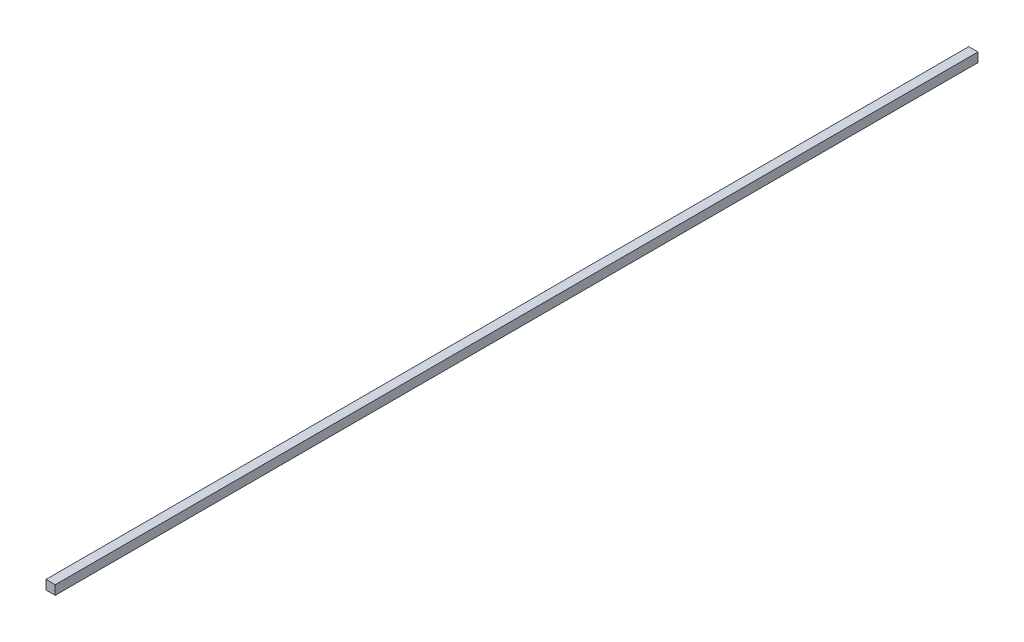
ISO-10303-21;
HEADER;
FILE_DESCRIPTION(('STEP AP214'),'2;1');
FILE_NAME('part.step','',(''),(''),'','','');
FILE_SCHEMA(('AUTOMOTIVE_DESIGN { 1 0 10303 214 1 1 1 1 }'));
ENDSEC;
DATA;
#1=APPLICATION_CONTEXT('core data for automotive mechanical design processes');
#2=APPLICATION_PROTOCOL_DEFINITION('international standard','automotive_design',2000,#1);
#3=PRODUCT_CONTEXT('',#1,'mechanical');
#4=PRODUCT('Part','Part','',(#3));
#5=PRODUCT_RELATED_PRODUCT_CATEGORY('part','',(#4));
#6=PRODUCT_DEFINITION_FORMATION('','',#4);
#7=PRODUCT_DEFINITION_CONTEXT('part definition',#1,'design');
#8=PRODUCT_DEFINITION('design','',#6,#7);
#9=PRODUCT_DEFINITION_SHAPE('','',#8);
#10=(LENGTH_UNIT() NAMED_UNIT(*) SI_UNIT(.MILLI.,.METRE.));
#11=(NAMED_UNIT(*) PLANE_ANGLE_UNIT() SI_UNIT($,.RADIAN.));
#12=(NAMED_UNIT(*) SI_UNIT($,.STERADIAN.) SOLID_ANGLE_UNIT());
#13=UNCERTAINTY_MEASURE_WITH_UNIT(LENGTH_MEASURE(1.E-05),#10,'distance_accuracy_value','');
#14=(GEOMETRIC_REPRESENTATION_CONTEXT(3) GLOBAL_UNCERTAINTY_ASSIGNED_CONTEXT((#13)) GLOBAL_UNIT_ASSIGNED_CONTEXT((#10,
#11,#12)) REPRESENTATION_CONTEXT('',''));
#15=CARTESIAN_POINT('',(0.,0.,0.));
#16=DIRECTION('',(0.,0.,1.));
#17=DIRECTION('',(1.,0.,0.));
#18=AXIS2_PLACEMENT_3D('',#15,#16,#17);
#19=CARTESIAN_POINT('',(0.,0.,1000.));
#20=DIRECTION('',(-1.,0.,0.));
#21=DIRECTION('',(0.,0.,1.));
#22=AXIS2_PLACEMENT_3D('',#19,#20,#21);
#23=PLANE('',#22);
#24=DIRECTION('',(0.,1.,0.));
#25=VECTOR('',#24,1.);
#26=CARTESIAN_POINT('',(0.,0.,0.));
#27=LINE('',#26,#25);
#28=CARTESIAN_POINT('',(0.,-9.99999999999999,0.));
#29=VERTEX_POINT('',#28);
#30=CARTESIAN_POINT('',(0.,0.,0.));
#31=VERTEX_POINT('',#30);
#32=EDGE_CURVE('E105',#29,#31,#27,.T.);
#33=ORIENTED_EDGE('',*,*,#32,.T.);
#34=DIRECTION('',(0.,0.,-1.));
#35=VECTOR('',#34,1.);
#36=CARTESIAN_POINT('',(0.,0.,1000.));
#37=LINE('',#36,#35);
#38=CARTESIAN_POINT('',(0.,0.,1000.));
#39=VERTEX_POINT('',#38);
#40=EDGE_CURVE('E12',#39,#31,#37,.T.);
#41=ORIENTED_EDGE('',*,*,#40,.F.);
#42=DIRECTION('',(0.,1.,0.));
#43=VECTOR('',#42,1.);
#44=CARTESIAN_POINT('',(0.,0.,1000.));
#45=LINE('',#44,#43);
#46=CARTESIAN_POINT('',(0.,-9.99999999999999,1000.));
#47=VERTEX_POINT('',#46);
#48=EDGE_CURVE('E94',#47,#39,#45,.T.);
#49=ORIENTED_EDGE('',*,*,#48,.F.);
#50=DIRECTION('',(0.,0.,-1.));
#51=VECTOR('',#50,1.);
#52=CARTESIAN_POINT('',(0.,-9.99999999999999,1000.));
#53=LINE('',#52,#51);
#54=EDGE_CURVE('E102',#47,#29,#53,.T.);
#55=ORIENTED_EDGE('',*,*,#54,.T.);
#56=EDGE_LOOP('',(#33,#41,#49,#55));
#57=FACE_BOUND('',#56,.T.);
#58=ADVANCED_FACE('F43',(#57),#23,.F.);
#59=CARTESIAN_POINT('',(0.,0.,1000.));
#60=DIRECTION('',(0.,-1.,0.));
#61=DIRECTION('',(0.,0.,-1.));
#62=AXIS2_PLACEMENT_3D('',#59,#60,#61);
#63=PLANE('',#62);
#64=DIRECTION('',(-1.,0.,0.));
#65=VECTOR('',#64,1.);
#66=CARTESIAN_POINT('',(0.,0.,0.));
#67=LINE('',#66,#65);
#68=CARTESIAN_POINT('',(-9.99999999999999,0.,0.));
#69=VERTEX_POINT('',#68);
#70=EDGE_CURVE('E98',#31,#69,#67,.T.);
#71=ORIENTED_EDGE('',*,*,#70,.T.);
#72=DIRECTION('',(0.,0.,-1.));
#73=VECTOR('',#72,1.);
#74=CARTESIAN_POINT('',(-9.99999999999999,0.,1000.));
#75=LINE('',#74,#73);
#76=CARTESIAN_POINT('',(-9.99999999999999,0.,1000.));
#77=VERTEX_POINT('',#76);
#78=EDGE_CURVE('E51',#77,#69,#75,.T.);
#79=ORIENTED_EDGE('',*,*,#78,.F.);
#80=DIRECTION('',(-1.,0.,0.));
#81=VECTOR('',#80,1.);
#82=CARTESIAN_POINT('',(0.,0.,1000.));
#83=LINE('',#82,#81);
#84=EDGE_CURVE('E89',#39,#77,#83,.T.);
#85=ORIENTED_EDGE('',*,*,#84,.F.);
#86=ORIENTED_EDGE('',*,*,#40,.T.);
#87=EDGE_LOOP('',(#71,#79,#85,#86));
#88=FACE_BOUND('',#87,.T.);
#89=ADVANCED_FACE('F97',(#88),#63,.F.);
#90=CARTESIAN_POINT('',(-9.99999999999999,0.,1000.));
#91=DIRECTION('',(1.,0.,0.));
#92=DIRECTION('',(0.,0.,-1.));
#93=AXIS2_PLACEMENT_3D('',#90,#91,#92);
#94=PLANE('',#93);
#95=DIRECTION('',(0.,-1.,0.));
#96=VECTOR('',#95,1.);
#97=CARTESIAN_POINT('',(-9.99999999999999,0.,0.));
#98=LINE('',#97,#96);
#99=CARTESIAN_POINT('',(-9.99999999999999,-10.,0.));
#100=VERTEX_POINT('',#99);
#101=EDGE_CURVE('E76',#69,#100,#98,.T.);
#102=ORIENTED_EDGE('',*,*,#101,.T.);
#103=DIRECTION('',(0.,0.,-1.));
#104=VECTOR('',#103,1.);
#105=CARTESIAN_POINT('',(-9.99999999999999,-10.,1000.));
#106=LINE('',#105,#104);
#107=CARTESIAN_POINT('',(-9.99999999999999,-10.,1000.));
#108=VERTEX_POINT('',#107);
#109=EDGE_CURVE('E99',#108,#100,#106,.T.);
#110=ORIENTED_EDGE('',*,*,#109,.F.);
#111=DIRECTION('',(0.,-1.,0.));
#112=VECTOR('',#111,1.);
#113=CARTESIAN_POINT('',(-9.99999999999999,0.,1000.));
#114=LINE('',#113,#112);
#115=EDGE_CURVE('E92',#77,#108,#114,.T.);
#116=ORIENTED_EDGE('',*,*,#115,.F.);
#117=ORIENTED_EDGE('',*,*,#78,.T.);
#118=EDGE_LOOP('',(#102,#110,#116,#117));
#119=FACE_BOUND('',#118,.T.);
#120=ADVANCED_FACE('F100',(#119),#94,.F.);
#121=CARTESIAN_POINT('',(0.,-9.99999999999999,1000.));
#122=DIRECTION('',(0.,1.,0.));
#123=DIRECTION('',(-1.,0.,0.));
#124=AXIS2_PLACEMENT_3D('',#121,#122,#123);
#125=PLANE('',#124);
#126=DIRECTION('',(1.,0.,0.));
#127=VECTOR('',#126,1.);
#128=CARTESIAN_POINT('',(0.,-9.99999999999999,0.));
#129=LINE('',#128,#127);
#130=EDGE_CURVE('E82',#100,#29,#129,.T.);
#131=ORIENTED_EDGE('',*,*,#130,.T.);
#132=ORIENTED_EDGE('',*,*,#54,.F.);
#133=DIRECTION('',(1.,0.,0.));
#134=VECTOR('',#133,1.);
#135=CARTESIAN_POINT('',(0.,-9.99999999999999,1000.));
#136=LINE('',#135,#134);
#137=EDGE_CURVE('E59',#108,#47,#136,.T.);
#138=ORIENTED_EDGE('',*,*,#137,.F.);
#139=ORIENTED_EDGE('',*,*,#109,.T.);
#140=EDGE_LOOP('',(#131,#132,#138,#139));
#141=FACE_BOUND('',#140,.T.);
#142=ADVANCED_FACE('F112',(#141),#125,.F.);
#143=CARTESIAN_POINT('',(0.,0.,1000.));
#144=DIRECTION('',(0.,0.,-1.));
#145=DIRECTION('',(-1.,0.,0.));
#146=AXIS2_PLACEMENT_3D('',#143,#144,#145);
#147=PLANE('',#146);
#148=ORIENTED_EDGE('',*,*,#48,.T.);
#149=ORIENTED_EDGE('',*,*,#84,.T.);
#150=ORIENTED_EDGE('',*,*,#115,.T.);
#151=ORIENTED_EDGE('',*,*,#137,.T.);
#152=EDGE_LOOP('',(#148,#149,#150,#151));
#153=FACE_BOUND('',#152,.T.);
#154=ADVANCED_FACE('F90',(#153),#147,.F.);
#155=CARTESIAN_POINT('',(0.,0.,0.));
#156=DIRECTION('',(0.,0.,-1.));
#157=DIRECTION('',(-1.,0.,0.));
#158=AXIS2_PLACEMENT_3D('',#155,#156,#157);
#159=PLANE('',#158);
#160=ORIENTED_EDGE('',*,*,#32,.F.);
#161=ORIENTED_EDGE('',*,*,#130,.F.);
#162=ORIENTED_EDGE('',*,*,#101,.F.);
#163=ORIENTED_EDGE('',*,*,#70,.F.);
#164=EDGE_LOOP('',(#160,#161,#162,#163));
#165=FACE_BOUND('',#164,.T.);
#166=ADVANCED_FACE('F115',(#165),#159,.T.);
#167=CLOSED_SHELL('',(#58,#89,#120,#142,#154,#166));
#168=MANIFOLD_SOLID_BREP('B2',#167);
#169=ADVANCED_BREP_SHAPE_REPRESENTATION('',(#18,#168),#14);
#170=SHAPE_DEFINITION_REPRESENTATION(#9,#169);
ENDSEC;
END-ISO-10303-21;
